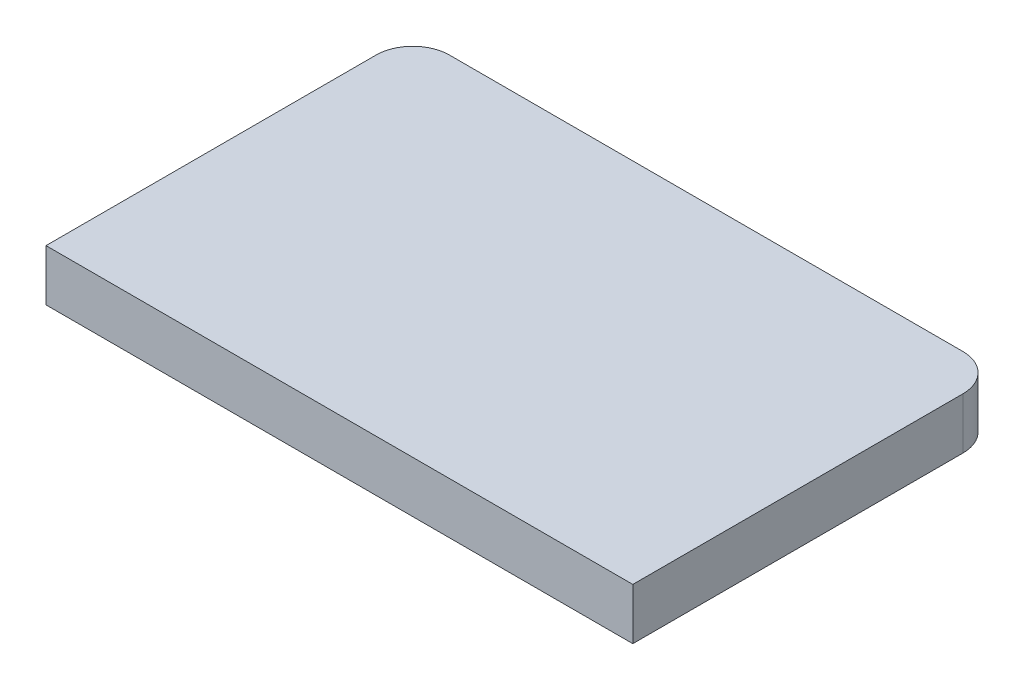
ISO-10303-21;
HEADER;
FILE_DESCRIPTION(('STEP AP214'),'2;1');
FILE_NAME('part.step','',(''),(''),'','','');
FILE_SCHEMA(('AUTOMOTIVE_DESIGN { 1 0 10303 214 1 1 1 1 }'));
ENDSEC;
DATA;
#1=APPLICATION_CONTEXT('core data for automotive mechanical design processes');
#2=APPLICATION_PROTOCOL_DEFINITION('international standard','automotive_design',2000,#1);
#3=PRODUCT_CONTEXT('',#1,'mechanical');
#4=PRODUCT('Part','Part','',(#3));
#5=PRODUCT_RELATED_PRODUCT_CATEGORY('part','',(#4));
#6=PRODUCT_DEFINITION_FORMATION('','',#4);
#7=PRODUCT_DEFINITION_CONTEXT('part definition',#1,'design');
#8=PRODUCT_DEFINITION('design','',#6,#7);
#9=PRODUCT_DEFINITION_SHAPE('','',#8);
#10=(LENGTH_UNIT() NAMED_UNIT(*) SI_UNIT(.MILLI.,.METRE.));
#11=(NAMED_UNIT(*) PLANE_ANGLE_UNIT() SI_UNIT($,.RADIAN.));
#12=(NAMED_UNIT(*) SI_UNIT($,.STERADIAN.) SOLID_ANGLE_UNIT());
#13=UNCERTAINTY_MEASURE_WITH_UNIT(LENGTH_MEASURE(1.E-05),#10,'distance_accuracy_value','');
#14=(GEOMETRIC_REPRESENTATION_CONTEXT(3) GLOBAL_UNCERTAINTY_ASSIGNED_CONTEXT((#13)) GLOBAL_UNIT_ASSIGNED_CONTEXT((#10,
#11,#12)) REPRESENTATION_CONTEXT('',''));
#15=CARTESIAN_POINT('',(0.,0.,0.));
#16=DIRECTION('',(0.,0.,1.));
#17=DIRECTION('',(1.,0.,0.));
#18=AXIS2_PLACEMENT_3D('',#15,#16,#17);
#19=CARTESIAN_POINT('',(101.6,17.78,-63.5));
#20=DIRECTION('',(-1.,0.,0.));
#21=DIRECTION('',(0.,0.,1.));
#22=AXIS2_PLACEMENT_3D('',#19,#20,#21);
#23=PLANE('',#22);
#24=DIRECTION('',(0.,0.,-1.));
#25=VECTOR('',#24,1.);
#26=CARTESIAN_POINT('',(101.6,0.,-63.5));
#27=LINE('',#26,#25);
#28=CARTESIAN_POINT('',(101.6,0.,63.5));
#29=VERTEX_POINT('',#28);
#30=CARTESIAN_POINT('',(101.6,0.,-50.8));
#31=VERTEX_POINT('',#30);
#32=EDGE_CURVE('E143',#29,#31,#27,.T.);
#33=ORIENTED_EDGE('',*,*,#32,.T.);
#34=DIRECTION('',(0.,-1.,0.));
#35=VECTOR('',#34,1.);
#36=CARTESIAN_POINT('',(101.6,17.78,-50.8));
#37=LINE('',#36,#35);
#38=CARTESIAN_POINT('',(101.6,17.78,-50.8));
#39=VERTEX_POINT('',#38);
#40=EDGE_CURVE('E13',#31,#39,#37,.F.);
#41=ORIENTED_EDGE('',*,*,#40,.T.);
#42=DIRECTION('',(0.,0.,-1.));
#43=VECTOR('',#42,1.);
#44=CARTESIAN_POINT('',(101.6,17.78,-63.5));
#45=LINE('',#44,#43);
#46=CARTESIAN_POINT('',(101.6,17.78,63.5));
#47=VERTEX_POINT('',#46);
#48=EDGE_CURVE('E153',#47,#39,#45,.T.);
#49=ORIENTED_EDGE('',*,*,#48,.F.);
#50=DIRECTION('',(0.,-1.,0.));
#51=VECTOR('',#50,1.);
#52=CARTESIAN_POINT('',(101.6,17.78,63.5));
#53=LINE('',#52,#51);
#54=EDGE_CURVE('E132',#47,#29,#53,.T.);
#55=ORIENTED_EDGE('',*,*,#54,.T.);
#56=EDGE_LOOP('',(#33,#41,#49,#55));
#57=FACE_BOUND('',#56,.T.);
#58=ADVANCED_FACE('F54',(#57),#23,.F.);
#59=CARTESIAN_POINT('',(-101.6,17.78,-63.5));
#60=DIRECTION('',(0.,0.,1.));
#61=DIRECTION('',(1.,0.,0.));
#62=AXIS2_PLACEMENT_3D('',#59,#60,#61);
#63=PLANE('',#62);
#64=DIRECTION('',(-1.,0.,0.));
#65=VECTOR('',#64,1.);
#66=CARTESIAN_POINT('',(-101.6,0.,-63.5));
#67=LINE('',#66,#65);
#68=CARTESIAN_POINT('',(88.9,0.,-63.5));
#69=VERTEX_POINT('',#68);
#70=CARTESIAN_POINT('',(-88.9,0.,-63.5));
#71=VERTEX_POINT('',#70);
#72=EDGE_CURVE('E145',#69,#71,#67,.T.);
#73=ORIENTED_EDGE('',*,*,#72,.T.);
#74=DIRECTION('',(0.,-1.,0.));
#75=VECTOR('',#74,1.);
#76=CARTESIAN_POINT('',(-88.9,17.78,-63.5));
#77=LINE('',#76,#75);
#78=CARTESIAN_POINT('',(-88.9,17.78,-63.5));
#79=VERTEX_POINT('',#78);
#80=EDGE_CURVE('E78',#71,#79,#77,.F.);
#81=ORIENTED_EDGE('',*,*,#80,.T.);
#82=DIRECTION('',(-1.,0.,0.));
#83=VECTOR('',#82,1.);
#84=CARTESIAN_POINT('',(-101.6,17.78,-63.5));
#85=LINE('',#84,#83);
#86=CARTESIAN_POINT('',(88.9,17.78,-63.5));
#87=VERTEX_POINT('',#86);
#88=EDGE_CURVE('E122',#87,#79,#85,.T.);
#89=ORIENTED_EDGE('',*,*,#88,.F.);
#90=DIRECTION('',(0.,-1.,0.));
#91=VECTOR('',#90,1.);
#92=CARTESIAN_POINT('',(88.9,17.78,-63.5));
#93=LINE('',#92,#91);
#94=EDGE_CURVE('E162',#87,#69,#93,.T.);
#95=ORIENTED_EDGE('',*,*,#94,.T.);
#96=EDGE_LOOP('',(#73,#81,#89,#95));
#97=FACE_BOUND('',#96,.T.);
#98=ADVANCED_FACE('F221',(#97),#63,.F.);
#99=CARTESIAN_POINT('',(-101.6,17.78,-63.5));
#100=DIRECTION('',(1.,0.,0.));
#101=DIRECTION('',(0.,0.,-1.));
#102=AXIS2_PLACEMENT_3D('',#99,#100,#101);
#103=PLANE('',#102);
#104=DIRECTION('',(0.,0.,1.));
#105=VECTOR('',#104,1.);
#106=CARTESIAN_POINT('',(-101.6,17.78,-63.5));
#107=LINE('',#106,#105);
#108=CARTESIAN_POINT('',(-101.6,17.78,-50.8));
#109=VERTEX_POINT('',#108);
#110=CARTESIAN_POINT('',(-101.6,17.78,63.5));
#111=VERTEX_POINT('',#110);
#112=EDGE_CURVE('E111',#109,#111,#107,.T.);
#113=ORIENTED_EDGE('',*,*,#112,.F.);
#114=DIRECTION('',(0.,-1.,0.));
#115=VECTOR('',#114,1.);
#116=CARTESIAN_POINT('',(-101.6,17.78,-50.8));
#117=LINE('',#116,#115);
#118=CARTESIAN_POINT('',(-101.6,0.,-50.8));
#119=VERTEX_POINT('',#118);
#120=EDGE_CURVE('E131',#109,#119,#117,.T.);
#121=ORIENTED_EDGE('',*,*,#120,.T.);
#122=DIRECTION('',(0.,0.,1.));
#123=VECTOR('',#122,1.);
#124=CARTESIAN_POINT('',(-101.6,0.,-63.5));
#125=LINE('',#124,#123);
#126=CARTESIAN_POINT('',(-101.6,0.,63.5));
#127=VERTEX_POINT('',#126);
#128=EDGE_CURVE('E128',#119,#127,#125,.T.);
#129=ORIENTED_EDGE('',*,*,#128,.T.);
#130=DIRECTION('',(0.,-1.,0.));
#131=VECTOR('',#130,1.);
#132=CARTESIAN_POINT('',(-101.6,17.78,63.5));
#133=LINE('',#132,#131);
#134=EDGE_CURVE('E125',#111,#127,#133,.T.);
#135=ORIENTED_EDGE('',*,*,#134,.F.);
#136=EDGE_LOOP('',(#113,#121,#129,#135));
#137=FACE_BOUND('',#136,.T.);
#138=ADVANCED_FACE('F126',(#137),#103,.F.);
#139=CARTESIAN_POINT('',(-101.6,17.78,63.5));
#140=DIRECTION('',(0.,0.,-1.));
#141=DIRECTION('',(-1.,0.,0.));
#142=AXIS2_PLACEMENT_3D('',#139,#140,#141);
#143=PLANE('',#142);
#144=DIRECTION('',(1.,0.,0.));
#145=VECTOR('',#144,1.);
#146=CARTESIAN_POINT('',(-101.6,0.,63.5));
#147=LINE('',#146,#145);
#148=EDGE_CURVE('E151',#127,#29,#147,.T.);
#149=ORIENTED_EDGE('',*,*,#148,.T.);
#150=ORIENTED_EDGE('',*,*,#54,.F.);
#151=DIRECTION('',(1.,0.,0.));
#152=VECTOR('',#151,1.);
#153=CARTESIAN_POINT('',(-101.6,17.78,63.5));
#154=LINE('',#153,#152);
#155=EDGE_CURVE('E115',#111,#47,#154,.T.);
#156=ORIENTED_EDGE('',*,*,#155,.F.);
#157=ORIENTED_EDGE('',*,*,#134,.T.);
#158=EDGE_LOOP('',(#149,#150,#156,#157));
#159=FACE_BOUND('',#158,.T.);
#160=ADVANCED_FACE('F134',(#159),#143,.F.);
#161=CARTESIAN_POINT('',(0.,17.78,0.));
#162=DIRECTION('',(0.,1.,0.));
#163=DIRECTION('',(0.,0.,1.));
#164=AXIS2_PLACEMENT_3D('',#161,#162,#163);
#165=PLANE('',#164);
#166=ORIENTED_EDGE('',*,*,#88,.T.);
#167=CARTESIAN_POINT('',(-88.9,17.78,-50.8));
#168=DIRECTION('',(0.,1.,0.));
#169=DIRECTION('',(0.,0.,1.));
#170=AXIS2_PLACEMENT_3D('',#167,#168,#169);
#171=CIRCLE('',#170,12.7);
#172=EDGE_CURVE('E62',#79,#109,#171,.T.);
#173=ORIENTED_EDGE('',*,*,#172,.T.);
#174=ORIENTED_EDGE('',*,*,#112,.T.);
#175=ORIENTED_EDGE('',*,*,#155,.T.);
#176=ORIENTED_EDGE('',*,*,#48,.T.);
#177=CARTESIAN_POINT('',(88.9,17.78,-50.8));
#178=DIRECTION('',(0.,1.,0.));
#179=DIRECTION('',(0.,0.,1.));
#180=AXIS2_PLACEMENT_3D('',#177,#178,#179);
#181=CIRCLE('',#180,12.7);
#182=EDGE_CURVE('E167',#39,#87,#181,.T.);
#183=ORIENTED_EDGE('',*,*,#182,.T.);
#184=EDGE_LOOP('',(#166,#173,#174,#175,#176,#183));
#185=FACE_BOUND('',#184,.T.);
#186=ADVANCED_FACE('F113',(#185),#165,.T.);
#187=CARTESIAN_POINT('',(0.,0.,0.));
#188=DIRECTION('',(0.,1.,0.));
#189=DIRECTION('',(0.,0.,1.));
#190=AXIS2_PLACEMENT_3D('',#187,#188,#189);
#191=PLANE('',#190);
#192=CARTESIAN_POINT('',(50.8,0.,49.8348));
#193=DIRECTION('',(0.,-1.,0.));
#194=DIRECTION('',(0.,0.,-1.));
#195=AXIS2_PLACEMENT_3D('',#192,#193,#194);
#196=CIRCLE('',#195,2.0828);
#197=CARTESIAN_POINT('',(50.8,0.,47.752));
#198=VERTEX_POINT('',#197);
#199=EDGE_CURVE('E190',#198,#198,#196,.T.);
#200=ORIENTED_EDGE('',*,*,#199,.F.);
#201=EDGE_LOOP('',(#200));
#202=FACE_BOUND('',#201,.T.);
#203=CARTESIAN_POINT('',(33.5788,0.,25.0698));
#204=DIRECTION('',(0.,-1.,0.));
#205=DIRECTION('',(0.,0.,-1.));
#206=AXIS2_PLACEMENT_3D('',#203,#204,#205);
#207=CIRCLE('',#206,2.0828);
#208=CARTESIAN_POINT('',(33.5788,0.,22.987));
#209=VERTEX_POINT('',#208);
#210=EDGE_CURVE('E184',#209,#209,#207,.T.);
#211=ORIENTED_EDGE('',*,*,#210,.F.);
#212=EDGE_LOOP('',(#211));
#213=FACE_BOUND('',#212,.T.);
#214=CARTESIAN_POINT('',(-50.8,0.,25.0698));
#215=DIRECTION('',(0.,-1.,0.));
#216=DIRECTION('',(0.,0.,-1.));
#217=AXIS2_PLACEMENT_3D('',#214,#215,#216);
#218=CIRCLE('',#217,2.0828);
#219=CARTESIAN_POINT('',(-50.8,0.,22.987));
#220=VERTEX_POINT('',#219);
#221=EDGE_CURVE('E178',#220,#220,#218,.T.);
#222=ORIENTED_EDGE('',*,*,#221,.F.);
#223=EDGE_LOOP('',(#222));
#224=FACE_BOUND('',#223,.T.);
#225=CARTESIAN_POINT('',(-33.5788,0.,49.8348));
#226=DIRECTION('',(0.,-1.,0.));
#227=DIRECTION('',(0.,0.,-1.));
#228=AXIS2_PLACEMENT_3D('',#225,#226,#227);
#229=CIRCLE('',#228,2.0828);
#230=CARTESIAN_POINT('',(-33.5788,0.,47.752));
#231=VERTEX_POINT('',#230);
#232=EDGE_CURVE('E171',#231,#231,#229,.T.);
#233=ORIENTED_EDGE('',*,*,#232,.F.);
#234=EDGE_LOOP('',(#233));
#235=FACE_BOUND('',#234,.T.);
#236=ORIENTED_EDGE('',*,*,#128,.F.);
#237=CARTESIAN_POINT('',(-88.9,0.,-50.8));
#238=DIRECTION('',(0.,1.,0.));
#239=DIRECTION('',(0.,0.,1.));
#240=AXIS2_PLACEMENT_3D('',#237,#238,#239);
#241=CIRCLE('',#240,12.7);
#242=EDGE_CURVE('E159',#119,#71,#241,.F.);
#243=ORIENTED_EDGE('',*,*,#242,.T.);
#244=ORIENTED_EDGE('',*,*,#72,.F.);
#245=CARTESIAN_POINT('',(88.9,0.,-50.8));
#246=DIRECTION('',(0.,1.,0.));
#247=DIRECTION('',(0.,0.,1.));
#248=AXIS2_PLACEMENT_3D('',#245,#246,#247);
#249=CIRCLE('',#248,12.7);
#250=EDGE_CURVE('E157',#69,#31,#249,.F.);
#251=ORIENTED_EDGE('',*,*,#250,.T.);
#252=ORIENTED_EDGE('',*,*,#32,.F.);
#253=ORIENTED_EDGE('',*,*,#148,.F.);
#254=EDGE_LOOP('',(#236,#243,#244,#251,#252,#253));
#255=FACE_BOUND('',#254,.T.);
#256=ADVANCED_FACE('F205',(#202,#213,#224,#235,#255),#191,.F.);
#257=CARTESIAN_POINT('',(-88.9,17.78,-50.8));
#258=DIRECTION('',(0.,-1.,0.));
#259=DIRECTION('',(0.,0.,-1.));
#260=AXIS2_PLACEMENT_3D('',#257,#258,#259);
#261=CYLINDRICAL_SURFACE('',#260,12.7);
#262=ORIENTED_EDGE('',*,*,#172,.F.);
#263=ORIENTED_EDGE('',*,*,#80,.F.);
#264=ORIENTED_EDGE('',*,*,#242,.F.);
#265=ORIENTED_EDGE('',*,*,#120,.F.);
#266=EDGE_LOOP('',(#262,#263,#264,#265));
#267=FACE_BOUND('',#266,.T.);
#268=ADVANCED_FACE('F208',(#267),#261,.T.);
#269=CARTESIAN_POINT('',(88.9,17.78,-50.8));
#270=DIRECTION('',(0.,-1.,0.));
#271=DIRECTION('',(0.,0.,-1.));
#272=AXIS2_PLACEMENT_3D('',#269,#270,#271);
#273=CYLINDRICAL_SURFACE('',#272,12.7);
#274=ORIENTED_EDGE('',*,*,#182,.F.);
#275=ORIENTED_EDGE('',*,*,#40,.F.);
#276=ORIENTED_EDGE('',*,*,#250,.F.);
#277=ORIENTED_EDGE('',*,*,#94,.F.);
#278=EDGE_LOOP('',(#274,#275,#276,#277));
#279=FACE_BOUND('',#278,.T.);
#280=ADVANCED_FACE('F56',(#279),#273,.T.);
#281=CARTESIAN_POINT('',(-33.5788,12.7,49.8348));
#282=DIRECTION('',(0.,-1.,0.));
#283=DIRECTION('',(0.,0.,-1.));
#284=AXIS2_PLACEMENT_3D('',#281,#282,#283);
#285=CYLINDRICAL_SURFACE('',#284,2.0828);
#286=CARTESIAN_POINT('',(-33.5788,12.7,49.8348));
#287=DIRECTION('',(0.,-1.,0.));
#288=DIRECTION('',(0.,0.,-1.));
#289=AXIS2_PLACEMENT_3D('',#286,#287,#288);
#290=CIRCLE('',#289,2.0828);
#291=CARTESIAN_POINT('',(-33.5788,12.7,47.752));
#292=VERTEX_POINT('',#291);
#293=EDGE_CURVE('E175',#292,#292,#290,.T.);
#294=ORIENTED_EDGE('',*,*,#293,.F.);
#295=EDGE_LOOP('',(#294));
#296=FACE_BOUND('',#295,.T.);
#297=ORIENTED_EDGE('',*,*,#232,.T.);
#298=EDGE_LOOP('',(#297));
#299=FACE_BOUND('',#298,.T.);
#300=ADVANCED_FACE('F228',(#296,#299),#285,.F.);
#301=CARTESIAN_POINT('',(-33.5788,12.7,49.8348));
#302=DIRECTION('',(0.,-1.,0.));
#303=DIRECTION('',(0.,0.,-1.));
#304=AXIS2_PLACEMENT_3D('',#301,#302,#303);
#305=PLANE('',#304);
#306=ORIENTED_EDGE('',*,*,#293,.T.);
#307=EDGE_LOOP('',(#306));
#308=FACE_BOUND('',#307,.T.);
#309=ADVANCED_FACE('F244',(#308),#305,.T.);
#310=CARTESIAN_POINT('',(-50.8,12.7,25.0698));
#311=DIRECTION('',(0.,-1.,0.));
#312=DIRECTION('',(0.,0.,-1.));
#313=AXIS2_PLACEMENT_3D('',#310,#311,#312);
#314=CYLINDRICAL_SURFACE('',#313,2.0828);
#315=CARTESIAN_POINT('',(-50.8,12.7,25.0698));
#316=DIRECTION('',(0.,-1.,0.));
#317=DIRECTION('',(0.,0.,-1.));
#318=AXIS2_PLACEMENT_3D('',#315,#316,#317);
#319=CIRCLE('',#318,2.0828);
#320=CARTESIAN_POINT('',(-50.8,12.7,22.987));
#321=VERTEX_POINT('',#320);
#322=EDGE_CURVE('E181',#321,#321,#319,.T.);
#323=ORIENTED_EDGE('',*,*,#322,.F.);
#324=EDGE_LOOP('',(#323));
#325=FACE_BOUND('',#324,.T.);
#326=ORIENTED_EDGE('',*,*,#221,.T.);
#327=EDGE_LOOP('',(#326));
#328=FACE_BOUND('',#327,.T.);
#329=ADVANCED_FACE('F248',(#325,#328),#314,.F.);
#330=CARTESIAN_POINT('',(-50.8,12.7,25.0698));
#331=DIRECTION('',(0.,-1.,0.));
#332=DIRECTION('',(0.,0.,-1.));
#333=AXIS2_PLACEMENT_3D('',#330,#331,#332);
#334=PLANE('',#333);
#335=ORIENTED_EDGE('',*,*,#322,.T.);
#336=EDGE_LOOP('',(#335));
#337=FACE_BOUND('',#336,.T.);
#338=ADVANCED_FACE('F252',(#337),#334,.T.);
#339=CARTESIAN_POINT('',(33.5788,12.7,25.0698));
#340=DIRECTION('',(0.,-1.,0.));
#341=DIRECTION('',(0.,0.,-1.));
#342=AXIS2_PLACEMENT_3D('',#339,#340,#341);
#343=CYLINDRICAL_SURFACE('',#342,2.0828);
#344=CARTESIAN_POINT('',(33.5788,12.7,25.0698));
#345=DIRECTION('',(0.,-1.,0.));
#346=DIRECTION('',(0.,0.,-1.));
#347=AXIS2_PLACEMENT_3D('',#344,#345,#346);
#348=CIRCLE('',#347,2.0828);
#349=CARTESIAN_POINT('',(33.5788,12.7,22.987));
#350=VERTEX_POINT('',#349);
#351=EDGE_CURVE('E187',#350,#350,#348,.T.);
#352=ORIENTED_EDGE('',*,*,#351,.F.);
#353=EDGE_LOOP('',(#352));
#354=FACE_BOUND('',#353,.T.);
#355=ORIENTED_EDGE('',*,*,#210,.T.);
#356=EDGE_LOOP('',(#355));
#357=FACE_BOUND('',#356,.T.);
#358=ADVANCED_FACE('F256',(#354,#357),#343,.F.);
#359=CARTESIAN_POINT('',(33.5788,12.7,25.0698));
#360=DIRECTION('',(0.,-1.,0.));
#361=DIRECTION('',(0.,0.,-1.));
#362=AXIS2_PLACEMENT_3D('',#359,#360,#361);
#363=PLANE('',#362);
#364=ORIENTED_EDGE('',*,*,#351,.T.);
#365=EDGE_LOOP('',(#364));
#366=FACE_BOUND('',#365,.T.);
#367=ADVANCED_FACE('F201',(#366),#363,.T.);
#368=CARTESIAN_POINT('',(50.8,12.7,49.8348));
#369=DIRECTION('',(0.,-1.,0.));
#370=DIRECTION('',(0.,0.,-1.));
#371=AXIS2_PLACEMENT_3D('',#368,#369,#370);
#372=CYLINDRICAL_SURFACE('',#371,2.0828);
#373=CARTESIAN_POINT('',(50.8,12.7,49.8348));
#374=DIRECTION('',(0.,-1.,0.));
#375=DIRECTION('',(0.,0.,-1.));
#376=AXIS2_PLACEMENT_3D('',#373,#374,#375);
#377=CIRCLE('',#376,2.0828);
#378=CARTESIAN_POINT('',(50.8,12.7,47.752));
#379=VERTEX_POINT('',#378);
#380=EDGE_CURVE('E146',#379,#379,#377,.T.);
#381=ORIENTED_EDGE('',*,*,#380,.F.);
#382=EDGE_LOOP('',(#381));
#383=FACE_BOUND('',#382,.T.);
#384=ORIENTED_EDGE('',*,*,#199,.T.);
#385=EDGE_LOOP('',(#384));
#386=FACE_BOUND('',#385,.T.);
#387=ADVANCED_FACE('F198',(#383,#386),#372,.F.);
#388=CARTESIAN_POINT('',(50.8,12.7,49.8348));
#389=DIRECTION('',(0.,-1.,0.));
#390=DIRECTION('',(0.,0.,-1.));
#391=AXIS2_PLACEMENT_3D('',#388,#389,#390);
#392=PLANE('',#391);
#393=ORIENTED_EDGE('',*,*,#380,.T.);
#394=EDGE_LOOP('',(#393));
#395=FACE_BOUND('',#394,.T.);
#396=ADVANCED_FACE('F196',(#395),#392,.T.);
#397=CLOSED_SHELL('',(#58,#98,#138,#160,#186,#256,#268,#280,#300,#309,#329,#338,#358,#367,#387,#396));
#398=MANIFOLD_SOLID_BREP('B2',#397);
#399=ADVANCED_BREP_SHAPE_REPRESENTATION('',(#18,#398),#14);
#400=SHAPE_DEFINITION_REPRESENTATION(#9,#399);
ENDSEC;
END-ISO-10303-21;
